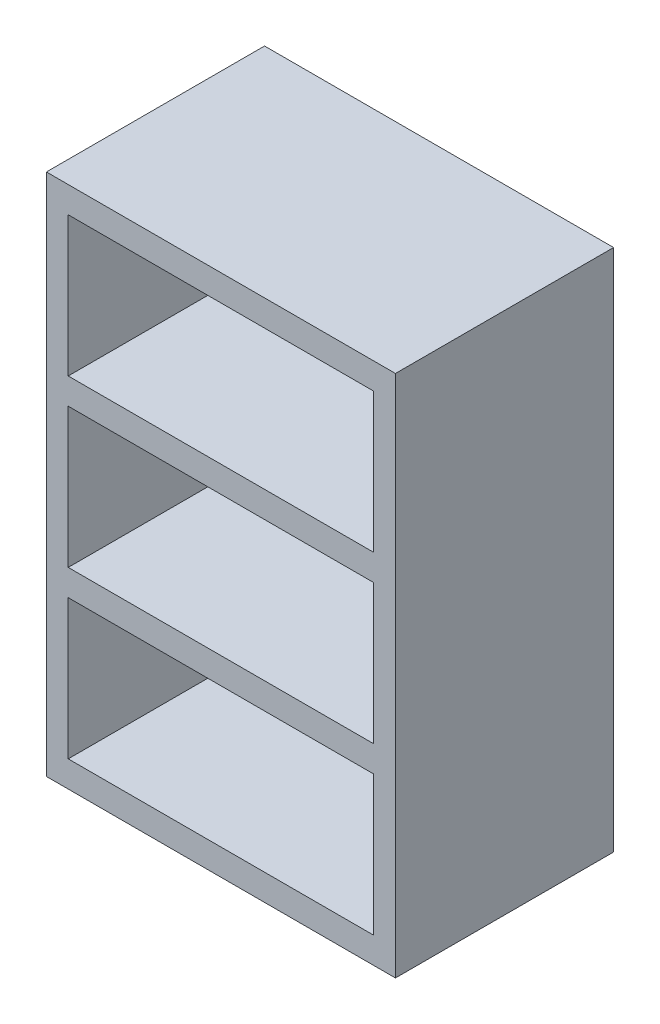
ISO-10303-21;
HEADER;
FILE_DESCRIPTION(('STEP AP214'),'2;1');
FILE_NAME('part.step','',(''),(''),'','','');
FILE_SCHEMA(('AUTOMOTIVE_DESIGN { 1 0 10303 214 1 1 1 1 }'));
ENDSEC;
DATA;
#1=APPLICATION_CONTEXT('core data for automotive mechanical design processes');
#2=APPLICATION_PROTOCOL_DEFINITION('international standard','automotive_design',2000,#1);
#3=PRODUCT_CONTEXT('',#1,'mechanical');
#4=PRODUCT('Part','Part','',(#3));
#5=PRODUCT_RELATED_PRODUCT_CATEGORY('part','',(#4));
#6=PRODUCT_DEFINITION_FORMATION('','',#4);
#7=PRODUCT_DEFINITION_CONTEXT('part definition',#1,'design');
#8=PRODUCT_DEFINITION('design','',#6,#7);
#9=PRODUCT_DEFINITION_SHAPE('','',#8);
#10=(LENGTH_UNIT() NAMED_UNIT(*) SI_UNIT(.MILLI.,.METRE.));
#11=(NAMED_UNIT(*) PLANE_ANGLE_UNIT() SI_UNIT($,.RADIAN.));
#12=(NAMED_UNIT(*) SI_UNIT($,.STERADIAN.) SOLID_ANGLE_UNIT());
#13=UNCERTAINTY_MEASURE_WITH_UNIT(LENGTH_MEASURE(1.E-05),#10,'distance_accuracy_value','');
#14=(GEOMETRIC_REPRESENTATION_CONTEXT(3) GLOBAL_UNCERTAINTY_ASSIGNED_CONTEXT((#13)) GLOBAL_UNIT_ASSIGNED_CONTEXT((#10,
#11,#12)) REPRESENTATION_CONTEXT('',''));
#15=CARTESIAN_POINT('',(0.,0.,0.));
#16=DIRECTION('',(0.,0.,1.));
#17=DIRECTION('',(1.,0.,0.));
#18=AXIS2_PLACEMENT_3D('',#15,#16,#17);
#19=CARTESIAN_POINT('',(400.,-600.,500.));
#20=DIRECTION('',(-1.,0.,0.));
#21=DIRECTION('',(0.,0.,1.));
#22=AXIS2_PLACEMENT_3D('',#19,#20,#21);
#23=PLANE('',#22);
#24=DIRECTION('',(0.,1.,0.));
#25=VECTOR('',#24,1.);
#26=CARTESIAN_POINT('',(400.,-600.,0.));
#27=LINE('',#26,#25);
#28=CARTESIAN_POINT('',(400.,-600.,0.));
#29=VERTEX_POINT('',#28);
#30=CARTESIAN_POINT('',(400.,600.,0.));
#31=VERTEX_POINT('',#30);
#32=EDGE_CURVE('E198',#29,#31,#27,.T.);
#33=ORIENTED_EDGE('',*,*,#32,.T.);
#34=DIRECTION('',(0.,0.,-1.));
#35=VECTOR('',#34,1.);
#36=CARTESIAN_POINT('',(400.,600.,500.));
#37=LINE('',#36,#35);
#38=CARTESIAN_POINT('',(400.,600.,500.));
#39=VERTEX_POINT('',#38);
#40=EDGE_CURVE('E11',#39,#31,#37,.T.);
#41=ORIENTED_EDGE('',*,*,#40,.F.);
#42=DIRECTION('',(0.,1.,0.));
#43=VECTOR('',#42,1.);
#44=CARTESIAN_POINT('',(400.,-600.,500.));
#45=LINE('',#44,#43);
#46=CARTESIAN_POINT('',(400.,-600.,500.));
#47=VERTEX_POINT('',#46);
#48=EDGE_CURVE('E289',#47,#39,#45,.T.);
#49=ORIENTED_EDGE('',*,*,#48,.F.);
#50=DIRECTION('',(0.,0.,-1.));
#51=VECTOR('',#50,1.);
#52=CARTESIAN_POINT('',(400.,-600.,500.));
#53=LINE('',#52,#51);
#54=EDGE_CURVE('E303',#47,#29,#53,.T.);
#55=ORIENTED_EDGE('',*,*,#54,.T.);
#56=EDGE_LOOP('',(#33,#41,#49,#55));
#57=FACE_BOUND('',#56,.T.);
#58=ADVANCED_FACE('F39',(#57),#23,.F.);
#59=CARTESIAN_POINT('',(-400.,600.,500.));
#60=DIRECTION('',(0.,-1.,0.));
#61=DIRECTION('',(0.,0.,-1.));
#62=AXIS2_PLACEMENT_3D('',#59,#60,#61);
#63=PLANE('',#62);
#64=DIRECTION('',(-1.,0.,0.));
#65=VECTOR('',#64,1.);
#66=CARTESIAN_POINT('',(-400.,600.,0.));
#67=LINE('',#66,#65);
#68=CARTESIAN_POINT('',(-400.,600.,0.));
#69=VERTEX_POINT('',#68);
#70=EDGE_CURVE('E307',#31,#69,#67,.T.);
#71=ORIENTED_EDGE('',*,*,#70,.T.);
#72=DIRECTION('',(0.,0.,-1.));
#73=VECTOR('',#72,1.);
#74=CARTESIAN_POINT('',(-400.,600.,500.));
#75=LINE('',#74,#73);
#76=CARTESIAN_POINT('',(-400.,600.,500.));
#77=VERTEX_POINT('',#76);
#78=EDGE_CURVE('E47',#77,#69,#75,.T.);
#79=ORIENTED_EDGE('',*,*,#78,.F.);
#80=DIRECTION('',(-1.,0.,0.));
#81=VECTOR('',#80,1.);
#82=CARTESIAN_POINT('',(-400.,600.,500.));
#83=LINE('',#82,#81);
#84=EDGE_CURVE('E293',#39,#77,#83,.T.);
#85=ORIENTED_EDGE('',*,*,#84,.F.);
#86=ORIENTED_EDGE('',*,*,#40,.T.);
#87=EDGE_LOOP('',(#71,#79,#85,#86));
#88=FACE_BOUND('',#87,.T.);
#89=ADVANCED_FACE('F343',(#88),#63,.F.);
#90=CARTESIAN_POINT('',(-400.,-600.,500.));
#91=DIRECTION('',(1.,0.,0.));
#92=DIRECTION('',(0.,0.,-1.));
#93=AXIS2_PLACEMENT_3D('',#90,#91,#92);
#94=PLANE('',#93);
#95=DIRECTION('',(0.,-1.,0.));
#96=VECTOR('',#95,1.);
#97=CARTESIAN_POINT('',(-400.,-600.,0.));
#98=LINE('',#97,#96);
#99=CARTESIAN_POINT('',(-400.,-600.,0.));
#100=VERTEX_POINT('',#99);
#101=EDGE_CURVE('E310',#69,#100,#98,.T.);
#102=ORIENTED_EDGE('',*,*,#101,.T.);
#103=DIRECTION('',(0.,0.,-1.));
#104=VECTOR('',#103,1.);
#105=CARTESIAN_POINT('',(-400.,-600.,500.));
#106=LINE('',#105,#104);
#107=CARTESIAN_POINT('',(-400.,-600.,500.));
#108=VERTEX_POINT('',#107);
#109=EDGE_CURVE('E318',#108,#100,#106,.T.);
#110=ORIENTED_EDGE('',*,*,#109,.F.);
#111=DIRECTION('',(0.,-1.,0.));
#112=VECTOR('',#111,1.);
#113=CARTESIAN_POINT('',(-400.,-600.,500.));
#114=LINE('',#113,#112);
#115=EDGE_CURVE('E297',#77,#108,#114,.T.);
#116=ORIENTED_EDGE('',*,*,#115,.F.);
#117=ORIENTED_EDGE('',*,*,#78,.T.);
#118=EDGE_LOOP('',(#102,#110,#116,#117));
#119=FACE_BOUND('',#118,.T.);
#120=ADVANCED_FACE('F327',(#119),#94,.F.);
#121=CARTESIAN_POINT('',(-400.,-600.,500.));
#122=DIRECTION('',(0.,1.,0.));
#123=DIRECTION('',(0.,0.,1.));
#124=AXIS2_PLACEMENT_3D('',#121,#122,#123);
#125=PLANE('',#124);
#126=DIRECTION('',(1.,0.,0.));
#127=VECTOR('',#126,1.);
#128=CARTESIAN_POINT('',(-400.,-600.,0.));
#129=LINE('',#128,#127);
#130=EDGE_CURVE('E294',#100,#29,#129,.T.);
#131=ORIENTED_EDGE('',*,*,#130,.T.);
#132=ORIENTED_EDGE('',*,*,#54,.F.);
#133=DIRECTION('',(1.,0.,0.));
#134=VECTOR('',#133,1.);
#135=CARTESIAN_POINT('',(-400.,-600.,500.));
#136=LINE('',#135,#134);
#137=EDGE_CURVE('E300',#108,#47,#136,.T.);
#138=ORIENTED_EDGE('',*,*,#137,.F.);
#139=ORIENTED_EDGE('',*,*,#109,.T.);
#140=EDGE_LOOP('',(#131,#132,#138,#139));
#141=FACE_BOUND('',#140,.T.);
#142=ADVANCED_FACE('F336',(#141),#125,.F.);
#143=CARTESIAN_POINT('',(0.,0.,500.));
#144=DIRECTION('',(0.,0.,-1.));
#145=DIRECTION('',(-1.,0.,0.));
#146=AXIS2_PLACEMENT_3D('',#143,#144,#145);
#147=PLANE('',#146);
#148=DIRECTION('',(1.,0.,0.));
#149=VECTOR('',#148,1.);
#150=CARTESIAN_POINT('',(-350.,220.,500.));
#151=LINE('',#150,#149);
#152=CARTESIAN_POINT('',(-350.,220.,500.));
#153=VERTEX_POINT('',#152);
#154=CARTESIAN_POINT('',(350.,220.,500.));
#155=VERTEX_POINT('',#154);
#156=EDGE_CURVE('E188',#153,#155,#151,.T.);
#157=ORIENTED_EDGE('',*,*,#156,.F.);
#158=DIRECTION('',(0.,-1.,0.));
#159=VECTOR('',#158,1.);
#160=CARTESIAN_POINT('',(-350.,540.,500.));
#161=LINE('',#160,#159);
#162=CARTESIAN_POINT('',(-350.,540.,500.));
#163=VERTEX_POINT('',#162);
#164=EDGE_CURVE('E54',#163,#153,#161,.T.);
#165=ORIENTED_EDGE('',*,*,#164,.F.);
#166=DIRECTION('',(-1.,0.,0.));
#167=VECTOR('',#166,1.);
#168=CARTESIAN_POINT('',(-350.,540.,500.));
#169=LINE('',#168,#167);
#170=CARTESIAN_POINT('',(350.,540.,500.));
#171=VERTEX_POINT('',#170);
#172=EDGE_CURVE('E175',#171,#163,#169,.T.);
#173=ORIENTED_EDGE('',*,*,#172,.F.);
#174=DIRECTION('',(0.,1.,0.));
#175=VECTOR('',#174,1.);
#176=CARTESIAN_POINT('',(350.,540.,500.));
#177=LINE('',#176,#175);
#178=EDGE_CURVE('E179',#155,#171,#177,.T.);
#179=ORIENTED_EDGE('',*,*,#178,.F.);
#180=EDGE_LOOP('',(#157,#165,#173,#179));
#181=FACE_BOUND('',#180,.T.);
#182=DIRECTION('',(1.,0.,0.));
#183=VECTOR('',#182,1.);
#184=CARTESIAN_POINT('',(-350.,-160.,500.));
#185=LINE('',#184,#183);
#186=CARTESIAN_POINT('',(-350.,-160.,500.));
#187=VERTEX_POINT('',#186);
#188=CARTESIAN_POINT('',(350.,-160.,500.));
#189=VERTEX_POINT('',#188);
#190=EDGE_CURVE('E224',#187,#189,#185,.T.);
#191=ORIENTED_EDGE('',*,*,#190,.F.);
#192=DIRECTION('',(0.,-1.,0.));
#193=VECTOR('',#192,1.);
#194=CARTESIAN_POINT('',(-350.,160.,500.));
#195=LINE('',#194,#193);
#196=CARTESIAN_POINT('',(-350.,160.,500.));
#197=VERTEX_POINT('',#196);
#198=EDGE_CURVE('E62',#197,#187,#195,.T.);
#199=ORIENTED_EDGE('',*,*,#198,.F.);
#200=DIRECTION('',(-1.,0.,0.));
#201=VECTOR('',#200,1.);
#202=CARTESIAN_POINT('',(-350.,160.,500.));
#203=LINE('',#202,#201);
#204=CARTESIAN_POINT('',(350.,160.,500.));
#205=VERTEX_POINT('',#204);
#206=EDGE_CURVE('E209',#205,#197,#203,.T.);
#207=ORIENTED_EDGE('',*,*,#206,.F.);
#208=DIRECTION('',(0.,1.,0.));
#209=VECTOR('',#208,1.);
#210=CARTESIAN_POINT('',(350.,160.,500.));
#211=LINE('',#210,#209);
#212=EDGE_CURVE('E229',#189,#205,#211,.T.);
#213=ORIENTED_EDGE('',*,*,#212,.F.);
#214=EDGE_LOOP('',(#191,#199,#207,#213));
#215=FACE_BOUND('',#214,.T.);
#216=DIRECTION('',(1.,0.,0.));
#217=VECTOR('',#216,1.);
#218=CARTESIAN_POINT('',(-350.,-540.,500.));
#219=LINE('',#218,#217);
#220=CARTESIAN_POINT('',(-350.,-540.,500.));
#221=VERTEX_POINT('',#220);
#222=CARTESIAN_POINT('',(350.,-540.,500.));
#223=VERTEX_POINT('',#222);
#224=EDGE_CURVE('E267',#221,#223,#219,.T.);
#225=ORIENTED_EDGE('',*,*,#224,.F.);
#226=DIRECTION('',(0.,-1.,0.));
#227=VECTOR('',#226,1.);
#228=CARTESIAN_POINT('',(-350.,-220.,500.));
#229=LINE('',#228,#227);
#230=CARTESIAN_POINT('',(-350.,-220.,500.));
#231=VERTEX_POINT('',#230);
#232=EDGE_CURVE('E264',#231,#221,#229,.T.);
#233=ORIENTED_EDGE('',*,*,#232,.F.);
#234=DIRECTION('',(-1.,0.,0.));
#235=VECTOR('',#234,1.);
#236=CARTESIAN_POINT('',(-350.,-220.,500.));
#237=LINE('',#236,#235);
#238=CARTESIAN_POINT('',(350.,-220.,500.));
#239=VERTEX_POINT('',#238);
#240=EDGE_CURVE('E251',#239,#231,#237,.T.);
#241=ORIENTED_EDGE('',*,*,#240,.F.);
#242=DIRECTION('',(0.,1.,0.));
#243=VECTOR('',#242,1.);
#244=CARTESIAN_POINT('',(350.,-220.,500.));
#245=LINE('',#244,#243);
#246=EDGE_CURVE('E271',#223,#239,#245,.T.);
#247=ORIENTED_EDGE('',*,*,#246,.F.);
#248=EDGE_LOOP('',(#225,#233,#241,#247));
#249=FACE_BOUND('',#248,.T.);
#250=ORIENTED_EDGE('',*,*,#48,.T.);
#251=ORIENTED_EDGE('',*,*,#84,.T.);
#252=ORIENTED_EDGE('',*,*,#115,.T.);
#253=ORIENTED_EDGE('',*,*,#137,.T.);
#254=EDGE_LOOP('',(#250,#251,#252,#253));
#255=FACE_BOUND('',#254,.T.);
#256=ADVANCED_FACE('F342',(#181,#215,#249,#255),#147,.F.);
#257=CARTESIAN_POINT('',(0.,0.,0.));
#258=DIRECTION('',(0.,0.,-1.));
#259=DIRECTION('',(-1.,0.,0.));
#260=AXIS2_PLACEMENT_3D('',#257,#258,#259);
#261=PLANE('',#260);
#262=ORIENTED_EDGE('',*,*,#32,.F.);
#263=ORIENTED_EDGE('',*,*,#130,.F.);
#264=ORIENTED_EDGE('',*,*,#101,.F.);
#265=ORIENTED_EDGE('',*,*,#70,.F.);
#266=EDGE_LOOP('',(#262,#263,#264,#265));
#267=FACE_BOUND('',#266,.T.);
#268=ADVANCED_FACE('F333',(#267),#261,.T.);
#269=CARTESIAN_POINT('',(-350.,-220.,100.));
#270=DIRECTION('',(-1.,0.,0.));
#271=DIRECTION('',(0.,-1.,0.));
#272=AXIS2_PLACEMENT_3D('',#269,#270,#271);
#273=PLANE('',#272);
#274=ORIENTED_EDGE('',*,*,#232,.T.);
#275=DIRECTION('',(0.,0.,1.));
#276=VECTOR('',#275,1.);
#277=CARTESIAN_POINT('',(-350.,-540.,100.));
#278=LINE('',#277,#276);
#279=CARTESIAN_POINT('',(-350.,-540.,100.));
#280=VERTEX_POINT('',#279);
#281=EDGE_CURVE('E263',#280,#221,#278,.T.);
#282=ORIENTED_EDGE('',*,*,#281,.F.);
#283=DIRECTION('',(0.,-1.,0.));
#284=VECTOR('',#283,1.);
#285=CARTESIAN_POINT('',(-350.,-220.,100.));
#286=LINE('',#285,#284);
#287=CARTESIAN_POINT('',(-350.,-220.,100.));
#288=VERTEX_POINT('',#287);
#289=EDGE_CURVE('E246',#288,#280,#286,.T.);
#290=ORIENTED_EDGE('',*,*,#289,.F.);
#291=DIRECTION('',(0.,0.,1.));
#292=VECTOR('',#291,1.);
#293=CARTESIAN_POINT('',(-350.,-220.,100.));
#294=LINE('',#293,#292);
#295=EDGE_CURVE('E225',#288,#231,#294,.T.);
#296=ORIENTED_EDGE('',*,*,#295,.T.);
#297=EDGE_LOOP('',(#274,#282,#290,#296));
#298=FACE_BOUND('',#297,.T.);
#299=ADVANCED_FACE('F355',(#298),#273,.F.);
#300=CARTESIAN_POINT('',(-350.,-220.,100.));
#301=DIRECTION('',(0.,1.,0.));
#302=DIRECTION('',(0.,0.,1.));
#303=AXIS2_PLACEMENT_3D('',#300,#301,#302);
#304=PLANE('',#303);
#305=ORIENTED_EDGE('',*,*,#240,.T.);
#306=ORIENTED_EDGE('',*,*,#295,.F.);
#307=DIRECTION('',(-1.,0.,0.));
#308=VECTOR('',#307,1.);
#309=CARTESIAN_POINT('',(-350.,-220.,100.));
#310=LINE('',#309,#308);
#311=CARTESIAN_POINT('',(350.,-220.,100.));
#312=VERTEX_POINT('',#311);
#313=EDGE_CURVE('E259',#312,#288,#310,.T.);
#314=ORIENTED_EDGE('',*,*,#313,.F.);
#315=DIRECTION('',(0.,0.,1.));
#316=VECTOR('',#315,1.);
#317=CARTESIAN_POINT('',(350.,-220.,100.));
#318=LINE('',#317,#316);
#319=EDGE_CURVE('E280',#312,#239,#318,.T.);
#320=ORIENTED_EDGE('',*,*,#319,.T.);
#321=EDGE_LOOP('',(#305,#306,#314,#320));
#322=FACE_BOUND('',#321,.T.);
#323=ADVANCED_FACE('F361',(#322),#304,.F.);
#324=CARTESIAN_POINT('',(350.,-220.,100.));
#325=DIRECTION('',(1.,0.,0.));
#326=DIRECTION('',(0.,1.,0.));
#327=AXIS2_PLACEMENT_3D('',#324,#325,#326);
#328=PLANE('',#327);
#329=ORIENTED_EDGE('',*,*,#246,.T.);
#330=ORIENTED_EDGE('',*,*,#319,.F.);
#331=DIRECTION('',(0.,1.,0.));
#332=VECTOR('',#331,1.);
#333=CARTESIAN_POINT('',(350.,-220.,100.));
#334=LINE('',#333,#332);
#335=CARTESIAN_POINT('',(350.,-540.,100.));
#336=VERTEX_POINT('',#335);
#337=EDGE_CURVE('E255',#336,#312,#334,.T.);
#338=ORIENTED_EDGE('',*,*,#337,.F.);
#339=DIRECTION('',(0.,0.,1.));
#340=VECTOR('',#339,1.);
#341=CARTESIAN_POINT('',(350.,-540.,100.));
#342=LINE('',#341,#340);
#343=EDGE_CURVE('E283',#336,#223,#342,.T.);
#344=ORIENTED_EDGE('',*,*,#343,.T.);
#345=EDGE_LOOP('',(#329,#330,#338,#344));
#346=FACE_BOUND('',#345,.T.);
#347=ADVANCED_FACE('F367',(#346),#328,.F.);
#348=CARTESIAN_POINT('',(-350.,-540.,100.));
#349=DIRECTION('',(0.,-1.,0.));
#350=DIRECTION('',(0.,0.,-1.));
#351=AXIS2_PLACEMENT_3D('',#348,#349,#350);
#352=PLANE('',#351);
#353=ORIENTED_EDGE('',*,*,#224,.T.);
#354=ORIENTED_EDGE('',*,*,#343,.F.);
#355=DIRECTION('',(1.,0.,0.));
#356=VECTOR('',#355,1.);
#357=CARTESIAN_POINT('',(-350.,-540.,100.));
#358=LINE('',#357,#356);
#359=EDGE_CURVE('E250',#280,#336,#358,.T.);
#360=ORIENTED_EDGE('',*,*,#359,.F.);
#361=ORIENTED_EDGE('',*,*,#281,.T.);
#362=EDGE_LOOP('',(#353,#354,#360,#361));
#363=FACE_BOUND('',#362,.T.);
#364=ADVANCED_FACE('F363',(#363),#352,.F.);
#365=CARTESIAN_POINT('',(0.,0.,100.));
#366=DIRECTION('',(0.,0.,1.));
#367=DIRECTION('',(1.,0.,0.));
#368=AXIS2_PLACEMENT_3D('',#365,#366,#367);
#369=PLANE('',#368);
#370=ORIENTED_EDGE('',*,*,#289,.T.);
#371=ORIENTED_EDGE('',*,*,#359,.T.);
#372=ORIENTED_EDGE('',*,*,#337,.T.);
#373=ORIENTED_EDGE('',*,*,#313,.T.);
#374=EDGE_LOOP('',(#370,#371,#372,#373));
#375=FACE_BOUND('',#374,.T.);
#376=ADVANCED_FACE('F366',(#375),#369,.T.);
#377=CARTESIAN_POINT('',(-350.,160.,100.));
#378=DIRECTION('',(-1.,0.,0.));
#379=DIRECTION('',(0.,0.,1.));
#380=AXIS2_PLACEMENT_3D('',#377,#378,#379);
#381=PLANE('',#380);
#382=ORIENTED_EDGE('',*,*,#198,.T.);
#383=DIRECTION('',(0.,0.,1.));
#384=VECTOR('',#383,1.);
#385=CARTESIAN_POINT('',(-350.,-160.,100.));
#386=LINE('',#385,#384);
#387=CARTESIAN_POINT('',(-350.,-160.,100.));
#388=VERTEX_POINT('',#387);
#389=EDGE_CURVE('E221',#388,#187,#386,.T.);
#390=ORIENTED_EDGE('',*,*,#389,.F.);
#391=DIRECTION('',(0.,-1.,0.));
#392=VECTOR('',#391,1.);
#393=CARTESIAN_POINT('',(-350.,160.,100.));
#394=LINE('',#393,#392);
#395=CARTESIAN_POINT('',(-350.,160.,100.));
#396=VERTEX_POINT('',#395);
#397=EDGE_CURVE('E204',#396,#388,#394,.T.);
#398=ORIENTED_EDGE('',*,*,#397,.F.);
#399=DIRECTION('',(0.,0.,1.));
#400=VECTOR('',#399,1.);
#401=CARTESIAN_POINT('',(-350.,160.,100.));
#402=LINE('',#401,#400);
#403=EDGE_CURVE('E189',#396,#197,#402,.T.);
#404=ORIENTED_EDGE('',*,*,#403,.T.);
#405=EDGE_LOOP('',(#382,#390,#398,#404));
#406=FACE_BOUND('',#405,.T.);
#407=ADVANCED_FACE('F377',(#406),#381,.F.);
#408=CARTESIAN_POINT('',(-350.,160.,100.));
#409=DIRECTION('',(0.,1.,0.));
#410=DIRECTION('',(0.,0.,1.));
#411=AXIS2_PLACEMENT_3D('',#408,#409,#410);
#412=PLANE('',#411);
#413=ORIENTED_EDGE('',*,*,#206,.T.);
#414=ORIENTED_EDGE('',*,*,#403,.F.);
#415=DIRECTION('',(-1.,0.,0.));
#416=VECTOR('',#415,1.);
#417=CARTESIAN_POINT('',(-350.,160.,100.));
#418=LINE('',#417,#416);
#419=CARTESIAN_POINT('',(350.,160.,100.));
#420=VERTEX_POINT('',#419);
#421=EDGE_CURVE('E217',#420,#396,#418,.T.);
#422=ORIENTED_EDGE('',*,*,#421,.F.);
#423=DIRECTION('',(0.,0.,1.));
#424=VECTOR('',#423,1.);
#425=CARTESIAN_POINT('',(350.,160.,100.));
#426=LINE('',#425,#424);
#427=EDGE_CURVE('E238',#420,#205,#426,.T.);
#428=ORIENTED_EDGE('',*,*,#427,.T.);
#429=EDGE_LOOP('',(#413,#414,#422,#428));
#430=FACE_BOUND('',#429,.T.);
#431=ADVANCED_FACE('F381',(#430),#412,.F.);
#432=CARTESIAN_POINT('',(350.,160.,100.));
#433=DIRECTION('',(1.,0.,0.));
#434=DIRECTION('',(0.,0.,-1.));
#435=AXIS2_PLACEMENT_3D('',#432,#433,#434);
#436=PLANE('',#435);
#437=ORIENTED_EDGE('',*,*,#212,.T.);
#438=ORIENTED_EDGE('',*,*,#427,.F.);
#439=DIRECTION('',(0.,1.,0.));
#440=VECTOR('',#439,1.);
#441=CARTESIAN_POINT('',(350.,160.,100.));
#442=LINE('',#441,#440);
#443=CARTESIAN_POINT('',(350.,-160.,100.));
#444=VERTEX_POINT('',#443);
#445=EDGE_CURVE('E213',#444,#420,#442,.T.);
#446=ORIENTED_EDGE('',*,*,#445,.F.);
#447=DIRECTION('',(0.,0.,1.));
#448=VECTOR('',#447,1.);
#449=CARTESIAN_POINT('',(350.,-160.,100.));
#450=LINE('',#449,#448);
#451=EDGE_CURVE('E241',#444,#189,#450,.T.);
#452=ORIENTED_EDGE('',*,*,#451,.T.);
#453=EDGE_LOOP('',(#437,#438,#446,#452));
#454=FACE_BOUND('',#453,.T.);
#455=ADVANCED_FACE('F386',(#454),#436,.F.);
#456=CARTESIAN_POINT('',(-350.,-160.,100.));
#457=DIRECTION('',(0.,-1.,0.));
#458=DIRECTION('',(0.,0.,-1.));
#459=AXIS2_PLACEMENT_3D('',#456,#457,#458);
#460=PLANE('',#459);
#461=ORIENTED_EDGE('',*,*,#190,.T.);
#462=ORIENTED_EDGE('',*,*,#451,.F.);
#463=DIRECTION('',(1.,0.,0.));
#464=VECTOR('',#463,1.);
#465=CARTESIAN_POINT('',(-350.,-160.,100.));
#466=LINE('',#465,#464);
#467=EDGE_CURVE('E208',#388,#444,#466,.T.);
#468=ORIENTED_EDGE('',*,*,#467,.F.);
#469=ORIENTED_EDGE('',*,*,#389,.T.);
#470=EDGE_LOOP('',(#461,#462,#468,#469));
#471=FACE_BOUND('',#470,.T.);
#472=ADVANCED_FACE('F382',(#471),#460,.F.);
#473=CARTESIAN_POINT('',(0.,0.,100.));
#474=DIRECTION('',(0.,0.,1.));
#475=DIRECTION('',(1.,0.,0.));
#476=AXIS2_PLACEMENT_3D('',#473,#474,#475);
#477=PLANE('',#476);
#478=ORIENTED_EDGE('',*,*,#397,.T.);
#479=ORIENTED_EDGE('',*,*,#467,.T.);
#480=ORIENTED_EDGE('',*,*,#445,.T.);
#481=ORIENTED_EDGE('',*,*,#421,.T.);
#482=EDGE_LOOP('',(#478,#479,#480,#481));
#483=FACE_BOUND('',#482,.T.);
#484=ADVANCED_FACE('F385',(#483),#477,.T.);
#485=CARTESIAN_POINT('',(-350.,540.,100.));
#486=DIRECTION('',(-1.,0.,0.));
#487=DIRECTION('',(0.,-1.,0.));
#488=AXIS2_PLACEMENT_3D('',#485,#486,#487);
#489=PLANE('',#488);
#490=ORIENTED_EDGE('',*,*,#164,.T.);
#491=DIRECTION('',(0.,0.,1.));
#492=VECTOR('',#491,1.);
#493=CARTESIAN_POINT('',(-350.,220.,100.));
#494=LINE('',#493,#492);
#495=CARTESIAN_POINT('',(-350.,220.,100.));
#496=VERTEX_POINT('',#495);
#497=EDGE_CURVE('E150',#496,#153,#494,.T.);
#498=ORIENTED_EDGE('',*,*,#497,.F.);
#499=DIRECTION('',(0.,-1.,0.));
#500=VECTOR('',#499,1.);
#501=CARTESIAN_POINT('',(-350.,540.,100.));
#502=LINE('',#501,#500);
#503=CARTESIAN_POINT('',(-350.,540.,100.));
#504=VERTEX_POINT('',#503);
#505=EDGE_CURVE('E154',#504,#496,#502,.T.);
#506=ORIENTED_EDGE('',*,*,#505,.F.);
#507=DIRECTION('',(0.,0.,1.));
#508=VECTOR('',#507,1.);
#509=CARTESIAN_POINT('',(-350.,540.,100.));
#510=LINE('',#509,#508);
#511=EDGE_CURVE('E195',#504,#163,#510,.T.);
#512=ORIENTED_EDGE('',*,*,#511,.T.);
#513=EDGE_LOOP('',(#490,#498,#506,#512));
#514=FACE_BOUND('',#513,.T.);
#515=ADVANCED_FACE('F152',(#514),#489,.F.);
#516=CARTESIAN_POINT('',(-350.,540.,100.));
#517=DIRECTION('',(0.,1.,0.));
#518=DIRECTION('',(0.,0.,1.));
#519=AXIS2_PLACEMENT_3D('',#516,#517,#518);
#520=PLANE('',#519);
#521=ORIENTED_EDGE('',*,*,#172,.T.);
#522=ORIENTED_EDGE('',*,*,#511,.F.);
#523=DIRECTION('',(-1.,0.,0.));
#524=VECTOR('',#523,1.);
#525=CARTESIAN_POINT('',(-350.,540.,100.));
#526=LINE('',#525,#524);
#527=CARTESIAN_POINT('',(350.,540.,100.));
#528=VERTEX_POINT('',#527);
#529=EDGE_CURVE('E161',#528,#504,#526,.T.);
#530=ORIENTED_EDGE('',*,*,#529,.F.);
#531=DIRECTION('',(0.,0.,1.));
#532=VECTOR('',#531,1.);
#533=CARTESIAN_POINT('',(350.,540.,100.));
#534=LINE('',#533,#532);
#535=EDGE_CURVE('E199',#528,#171,#534,.T.);
#536=ORIENTED_EDGE('',*,*,#535,.T.);
#537=EDGE_LOOP('',(#521,#522,#530,#536));
#538=FACE_BOUND('',#537,.T.);
#539=ADVANCED_FACE('F399',(#538),#520,.F.);
#540=CARTESIAN_POINT('',(350.,540.,100.));
#541=DIRECTION('',(1.,0.,0.));
#542=DIRECTION('',(0.,0.,-1.));
#543=AXIS2_PLACEMENT_3D('',#540,#541,#542);
#544=PLANE('',#543);
#545=ORIENTED_EDGE('',*,*,#178,.T.);
#546=ORIENTED_EDGE('',*,*,#535,.F.);
#547=DIRECTION('',(0.,1.,0.));
#548=VECTOR('',#547,1.);
#549=CARTESIAN_POINT('',(350.,540.,100.));
#550=LINE('',#549,#548);
#551=CARTESIAN_POINT('',(350.,220.,100.));
#552=VERTEX_POINT('',#551);
#553=EDGE_CURVE('E170',#552,#528,#550,.T.);
#554=ORIENTED_EDGE('',*,*,#553,.F.);
#555=DIRECTION('',(0.,0.,1.));
#556=VECTOR('',#555,1.);
#557=CARTESIAN_POINT('',(350.,220.,100.));
#558=LINE('',#557,#556);
#559=EDGE_CURVE('E160',#552,#155,#558,.T.);
#560=ORIENTED_EDGE('',*,*,#559,.T.);
#561=EDGE_LOOP('',(#545,#546,#554,#560));
#562=FACE_BOUND('',#561,.T.);
#563=ADVANCED_FACE('F402',(#562),#544,.F.);
#564=CARTESIAN_POINT('',(-350.,220.,100.));
#565=DIRECTION('',(0.,-1.,0.));
#566=DIRECTION('',(0.,0.,-1.));
#567=AXIS2_PLACEMENT_3D('',#564,#565,#566);
#568=PLANE('',#567);
#569=ORIENTED_EDGE('',*,*,#156,.T.);
#570=ORIENTED_EDGE('',*,*,#559,.F.);
#571=DIRECTION('',(1.,0.,0.));
#572=VECTOR('',#571,1.);
#573=CARTESIAN_POINT('',(-350.,220.,100.));
#574=LINE('',#573,#572);
#575=EDGE_CURVE('E164',#496,#552,#574,.T.);
#576=ORIENTED_EDGE('',*,*,#575,.F.);
#577=ORIENTED_EDGE('',*,*,#497,.T.);
#578=EDGE_LOOP('',(#569,#570,#576,#577));
#579=FACE_BOUND('',#578,.T.);
#580=ADVANCED_FACE('F165',(#579),#568,.F.);
#581=CARTESIAN_POINT('',(0.,0.,100.));
#582=DIRECTION('',(0.,0.,1.));
#583=DIRECTION('',(1.,0.,0.));
#584=AXIS2_PLACEMENT_3D('',#581,#582,#583);
#585=PLANE('',#584);
#586=ORIENTED_EDGE('',*,*,#505,.T.);
#587=ORIENTED_EDGE('',*,*,#575,.T.);
#588=ORIENTED_EDGE('',*,*,#553,.T.);
#589=ORIENTED_EDGE('',*,*,#529,.T.);
#590=EDGE_LOOP('',(#586,#587,#588,#589));
#591=FACE_BOUND('',#590,.T.);
#592=ADVANCED_FACE('F172',(#591),#585,.T.);
#593=CLOSED_SHELL('',(#58,#89,#120,#142,#256,#268,#299,#323,#347,#364,#376,#407,#431,#455,#472,
#484,#515,#539,#563,#580,#592));
#594=MANIFOLD_SOLID_BREP('B2',#593);
#595=ADVANCED_BREP_SHAPE_REPRESENTATION('',(#18,#594),#14);
#596=SHAPE_DEFINITION_REPRESENTATION(#9,#595);
ENDSEC;
END-ISO-10303-21;
